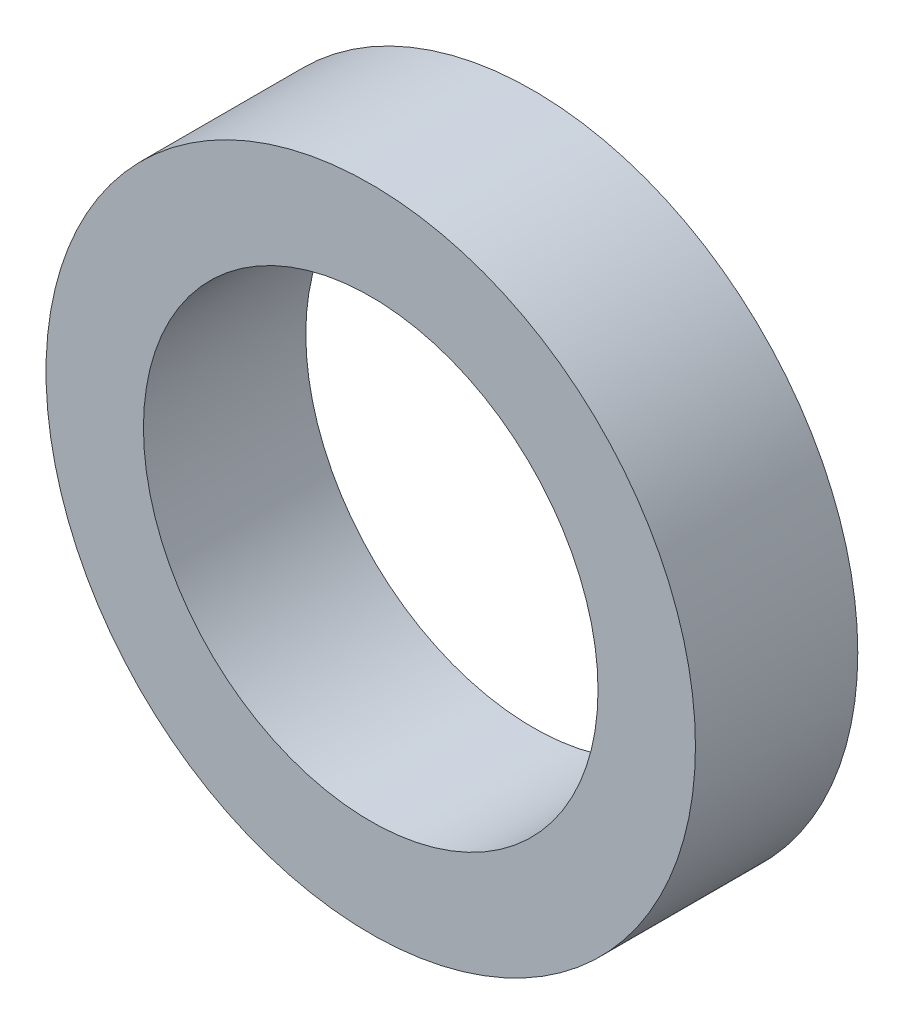
ISO-10303-21;
HEADER;
FILE_DESCRIPTION(('STEP AP214'),'2;1');
FILE_NAME('part.step','',(''),(''),'','','');
FILE_SCHEMA(('AUTOMOTIVE_DESIGN { 1 0 10303 214 1 1 1 1 }'));
ENDSEC;
DATA;
#1=APPLICATION_CONTEXT('core data for automotive mechanical design processes');
#2=APPLICATION_PROTOCOL_DEFINITION('international standard','automotive_design',2000,#1);
#3=PRODUCT_CONTEXT('',#1,'mechanical');
#4=PRODUCT('Part','Part','',(#3));
#5=PRODUCT_RELATED_PRODUCT_CATEGORY('part','',(#4));
#6=PRODUCT_DEFINITION_FORMATION('','',#4);
#7=PRODUCT_DEFINITION_CONTEXT('part definition',#1,'design');
#8=PRODUCT_DEFINITION('design','',#6,#7);
#9=PRODUCT_DEFINITION_SHAPE('','',#8);
#10=(LENGTH_UNIT() NAMED_UNIT(*) SI_UNIT(.MILLI.,.METRE.));
#11=(NAMED_UNIT(*) PLANE_ANGLE_UNIT() SI_UNIT($,.RADIAN.));
#12=(NAMED_UNIT(*) SI_UNIT($,.STERADIAN.) SOLID_ANGLE_UNIT());
#13=UNCERTAINTY_MEASURE_WITH_UNIT(LENGTH_MEASURE(1.E-05),#10,'distance_accuracy_value','');
#14=(GEOMETRIC_REPRESENTATION_CONTEXT(3) GLOBAL_UNCERTAINTY_ASSIGNED_CONTEXT((#13)) GLOBAL_UNIT_ASSIGNED_CONTEXT((#10,
#11,#12)) REPRESENTATION_CONTEXT('',''));
#15=CARTESIAN_POINT('',(0.,0.,0.));
#16=DIRECTION('',(0.,0.,1.));
#17=DIRECTION('',(1.,0.,0.));
#18=AXIS2_PLACEMENT_3D('',#15,#16,#17);
#19=CARTESIAN_POINT('',(0.,0.,5.));
#20=DIRECTION('',(0.,0.,1.));
#21=DIRECTION('',(1.,0.,0.));
#22=AXIS2_PLACEMENT_3D('',#19,#20,#21);
#23=PLANE('',#22);
#24=CARTESIAN_POINT('',(0.,0.,5.));
#25=DIRECTION('',(0.,0.,1.));
#26=DIRECTION('',(1.,0.,0.));
#27=AXIS2_PLACEMENT_3D('',#24,#25,#26);
#28=CIRCLE('',#27,10.);
#29=CARTESIAN_POINT('',(10.,0.,5.));
#30=VERTEX_POINT('',#29);
#31=EDGE_CURVE('E10',#30,#30,#28,.T.);
#32=ORIENTED_EDGE('',*,*,#31,.T.);
#33=EDGE_LOOP('',(#32));
#34=FACE_BOUND('',#33,.T.);
#35=CARTESIAN_POINT('',(0.,0.,5.));
#36=DIRECTION('',(0.,0.,1.));
#37=DIRECTION('',(1.,0.,0.));
#38=AXIS2_PLACEMENT_3D('',#35,#36,#37);
#39=CIRCLE('',#38,7.);
#40=CARTESIAN_POINT('',(7.,0.,5.));
#41=VERTEX_POINT('',#40);
#42=EDGE_CURVE('E54',#41,#41,#39,.T.);
#43=ORIENTED_EDGE('',*,*,#42,.F.);
#44=EDGE_LOOP('',(#43));
#45=FACE_BOUND('',#44,.T.);
#46=ADVANCED_FACE('F41',(#34,#45),#23,.T.);
#47=CARTESIAN_POINT('',(0.,0.,0.));
#48=DIRECTION('',(0.,0.,1.));
#49=DIRECTION('',(1.,0.,0.));
#50=AXIS2_PLACEMENT_3D('',#47,#48,#49);
#51=PLANE('',#50);
#52=CARTESIAN_POINT('',(0.,0.,0.));
#53=DIRECTION('',(0.,0.,1.));
#54=DIRECTION('',(1.,0.,0.));
#55=AXIS2_PLACEMENT_3D('',#52,#53,#54);
#56=CIRCLE('',#55,10.);
#57=CARTESIAN_POINT('',(10.,0.,0.));
#58=VERTEX_POINT('',#57);
#59=EDGE_CURVE('E45',#58,#58,#56,.T.);
#60=ORIENTED_EDGE('',*,*,#59,.F.);
#61=EDGE_LOOP('',(#60));
#62=FACE_BOUND('',#61,.T.);
#63=CARTESIAN_POINT('',(0.,0.,0.));
#64=DIRECTION('',(0.,0.,1.));
#65=DIRECTION('',(1.,0.,0.));
#66=AXIS2_PLACEMENT_3D('',#63,#64,#65);
#67=CIRCLE('',#66,7.);
#68=CARTESIAN_POINT('',(7.,0.,0.));
#69=VERTEX_POINT('',#68);
#70=EDGE_CURVE('E56',#69,#69,#67,.T.);
#71=ORIENTED_EDGE('',*,*,#70,.T.);
#72=EDGE_LOOP('',(#71));
#73=FACE_BOUND('',#72,.T.);
#74=ADVANCED_FACE('F68',(#62,#73),#51,.F.);
#75=CARTESIAN_POINT('',(0.,0.,5.));
#76=DIRECTION('',(0.,0.,-1.));
#77=DIRECTION('',(-1.,0.,0.));
#78=AXIS2_PLACEMENT_3D('',#75,#76,#77);
#79=CYLINDRICAL_SURFACE('',#78,10.);
#80=ORIENTED_EDGE('',*,*,#31,.F.);
#81=EDGE_LOOP('',(#80));
#82=FACE_BOUND('',#81,.T.);
#83=ORIENTED_EDGE('',*,*,#59,.T.);
#84=EDGE_LOOP('',(#83));
#85=FACE_BOUND('',#84,.T.);
#86=ADVANCED_FACE('F43',(#82,#85),#79,.T.);
#87=CARTESIAN_POINT('',(0.,0.,5.));
#88=DIRECTION('',(0.,0.,-1.));
#89=DIRECTION('',(-1.,0.,0.));
#90=AXIS2_PLACEMENT_3D('',#87,#88,#89);
#91=CYLINDRICAL_SURFACE('',#90,7.);
#92=ORIENTED_EDGE('',*,*,#42,.T.);
#93=EDGE_LOOP('',(#92));
#94=FACE_BOUND('',#93,.T.);
#95=ORIENTED_EDGE('',*,*,#70,.F.);
#96=EDGE_LOOP('',(#95));
#97=FACE_BOUND('',#96,.T.);
#98=ADVANCED_FACE('F64',(#94,#97),#91,.F.);
#99=CLOSED_SHELL('',(#46,#74,#86,#98));
#100=MANIFOLD_SOLID_BREP('B2',#99);
#101=ADVANCED_BREP_SHAPE_REPRESENTATION('',(#18,#100),#14);
#102=SHAPE_DEFINITION_REPRESENTATION(#9,#101);
ENDSEC;
END-ISO-10303-21;
